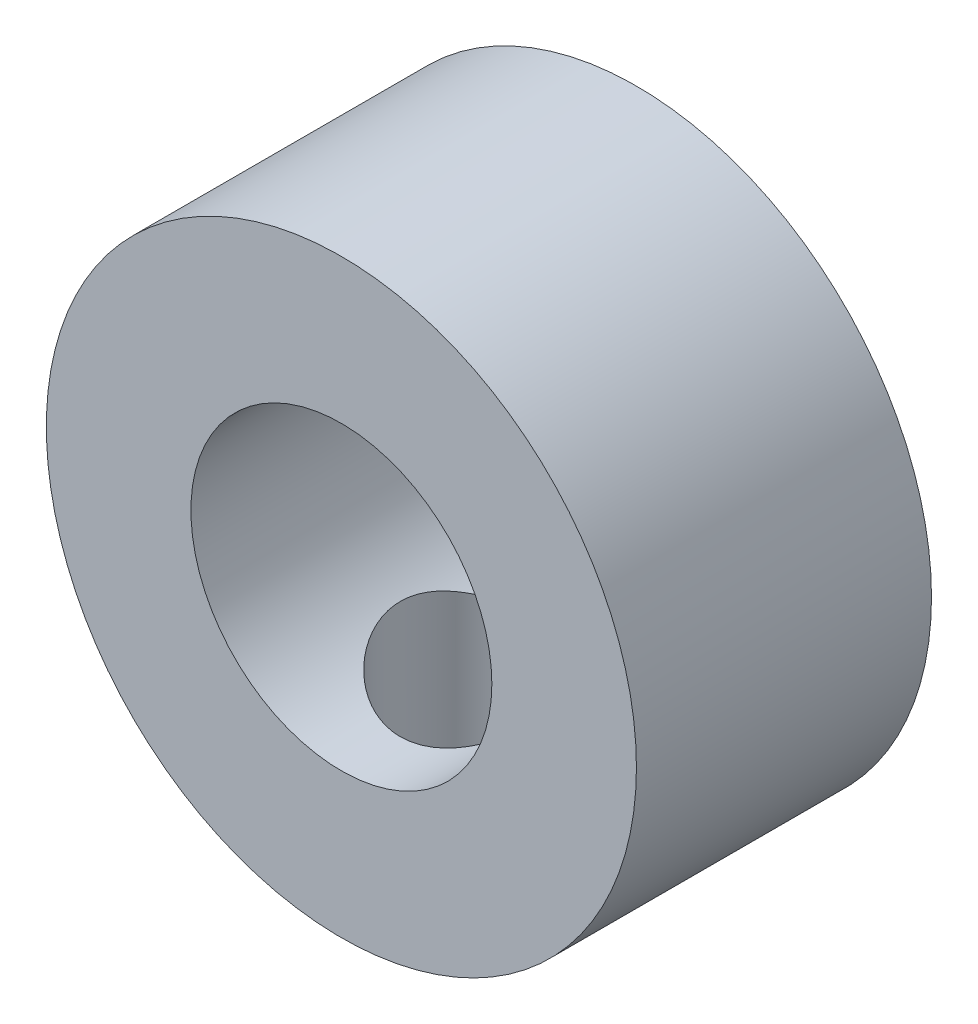
ISO-10303-21;
HEADER;
FILE_DESCRIPTION(('STEP AP214'),'2;1');
FILE_NAME('part.step','',(''),(''),'','','');
FILE_SCHEMA(('AUTOMOTIVE_DESIGN { 1 0 10303 214 1 1 1 1 }'));
ENDSEC;
DATA;
#1=APPLICATION_CONTEXT('core data for automotive mechanical design processes');
#2=APPLICATION_PROTOCOL_DEFINITION('international standard','automotive_design',2000,#1);
#3=PRODUCT_CONTEXT('',#1,'mechanical');
#4=PRODUCT('Part','Part','',(#3));
#5=PRODUCT_RELATED_PRODUCT_CATEGORY('part','',(#4));
#6=PRODUCT_DEFINITION_FORMATION('','',#4);
#7=PRODUCT_DEFINITION_CONTEXT('part definition',#1,'design');
#8=PRODUCT_DEFINITION('design','',#6,#7);
#9=PRODUCT_DEFINITION_SHAPE('','',#8);
#10=(LENGTH_UNIT() NAMED_UNIT(*) SI_UNIT(.MILLI.,.METRE.));
#11=(NAMED_UNIT(*) PLANE_ANGLE_UNIT() SI_UNIT($,.RADIAN.));
#12=(NAMED_UNIT(*) SI_UNIT($,.STERADIAN.) SOLID_ANGLE_UNIT());
#13=UNCERTAINTY_MEASURE_WITH_UNIT(LENGTH_MEASURE(1.E-05),#10,'distance_accuracy_value','');
#14=(GEOMETRIC_REPRESENTATION_CONTEXT(3) GLOBAL_UNCERTAINTY_ASSIGNED_CONTEXT((#13)) GLOBAL_UNIT_ASSIGNED_CONTEXT((#10,
#11,#12)) REPRESENTATION_CONTEXT('',''));
#15=CARTESIAN_POINT('',(0.,0.,0.));
#16=DIRECTION('',(0.,0.,1.));
#17=DIRECTION('',(1.,0.,0.));
#18=AXIS2_PLACEMENT_3D('',#15,#16,#17);
#19=CARTESIAN_POINT('',(0.,0.,5.));
#20=DIRECTION('',(0.,0.,1.));
#21=DIRECTION('',(1.,0.,0.));
#22=AXIS2_PLACEMENT_3D('',#19,#20,#21);
#23=PLANE('',#22);
#24=CARTESIAN_POINT('',(0.,0.,5.));
#25=DIRECTION('',(0.,0.,1.));
#26=DIRECTION('',(1.,0.,0.));
#27=AXIS2_PLACEMENT_3D('',#24,#25,#26);
#28=CIRCLE('',#27,5.);
#29=CARTESIAN_POINT('',(5.,0.,5.));
#30=VERTEX_POINT('',#29);
#31=EDGE_CURVE('E10',#30,#30,#28,.T.);
#32=ORIENTED_EDGE('',*,*,#31,.T.);
#33=EDGE_LOOP('',(#32));
#34=FACE_BOUND('',#33,.T.);
#35=CARTESIAN_POINT('',(0.,0.,5.));
#36=DIRECTION('',(0.,0.,1.));
#37=DIRECTION('',(1.,0.,0.));
#38=AXIS2_PLACEMENT_3D('',#35,#36,#37);
#39=CIRCLE('',#38,2.55);
#40=CARTESIAN_POINT('',(2.55,0.,5.));
#41=VERTEX_POINT('',#40);
#42=EDGE_CURVE('E51',#41,#41,#39,.T.);
#43=ORIENTED_EDGE('',*,*,#42,.F.);
#44=EDGE_LOOP('',(#43));
#45=FACE_BOUND('',#44,.T.);
#46=ADVANCED_FACE('F32',(#34,#45),#23,.T.);
#47=CARTESIAN_POINT('',(0.,0.,0.));
#48=DIRECTION('',(0.,0.,1.));
#49=DIRECTION('',(1.,0.,0.));
#50=AXIS2_PLACEMENT_3D('',#47,#48,#49);
#51=PLANE('',#50);
#52=CARTESIAN_POINT('',(0.,0.,0.));
#53=DIRECTION('',(0.,0.,1.));
#54=DIRECTION('',(1.,0.,0.));
#55=AXIS2_PLACEMENT_3D('',#52,#53,#54);
#56=CIRCLE('',#55,5.);
#57=CARTESIAN_POINT('',(5.,0.,0.));
#58=VERTEX_POINT('',#57);
#59=EDGE_CURVE('E46',#58,#58,#56,.T.);
#60=ORIENTED_EDGE('',*,*,#59,.F.);
#61=EDGE_LOOP('',(#60));
#62=FACE_BOUND('',#61,.T.);
#63=CARTESIAN_POINT('',(0.,0.,0.));
#64=DIRECTION('',(0.,0.,1.));
#65=DIRECTION('',(1.,0.,0.));
#66=AXIS2_PLACEMENT_3D('',#63,#64,#65);
#67=CIRCLE('',#66,2.55);
#68=CARTESIAN_POINT('',(2.55,0.,0.));
#69=VERTEX_POINT('',#68);
#70=EDGE_CURVE('E53',#69,#69,#67,.T.);
#71=ORIENTED_EDGE('',*,*,#70,.T.);
#72=EDGE_LOOP('',(#71));
#73=FACE_BOUND('',#72,.T.);
#74=ADVANCED_FACE('F74',(#62,#73),#51,.F.);
#75=CARTESIAN_POINT('',(0.,0.,5.));
#76=DIRECTION('',(0.,0.,-1.));
#77=DIRECTION('',(-1.,0.,0.));
#78=AXIS2_PLACEMENT_3D('',#75,#76,#77);
#79=CYLINDRICAL_SURFACE('',#78,5.);
#80=CARTESIAN_POINT('',(0.,-5.,4.));
#81=CARTESIAN_POINT('',(0.0822886127532999,-4.9999992925055,3.99999900251511));
#82=CARTESIAN_POINT('',(0.164587318351529,-4.99794915693954,3.99320613637603));
#83=CARTESIAN_POINT('',(0.326788125304881,-4.98997105593691,3.9662786457779));
#84=CARTESIAN_POINT('',(0.40668950441142,-4.98404193389692,3.94614004197666));
#85=CARTESIAN_POINT('',(0.561732707754526,-4.96895552501836,3.89325398308974));
#86=CARTESIAN_POINT('',(0.636881364395373,-4.95980300250425,3.86052513038106));
#87=CARTESIAN_POINT('',(0.780624181053131,-4.93922109237645,3.78346390694416));
#88=CARTESIAN_POINT('',(0.849217467469669,-4.92779140192067,3.73912999260458));
#89=CARTESIAN_POINT('',(0.979871797183745,-4.90350737192774,3.63877599252733));
#90=CARTESIAN_POINT('',(1.04171807124434,-4.89062383657036,3.58248337411409));
#91=CARTESIAN_POINT('',(1.15524920923324,-4.86505834210442,3.46039077008982));
#92=CARTESIAN_POINT('',(1.20693236327441,-4.85237641724501,3.39458918787504));
#93=CARTESIAN_POINT('',(1.29980037723708,-4.82834113993772,3.25352924696239));
#94=CARTESIAN_POINT('',(1.34072309022213,-4.81702406663875,3.17809153900926));
#95=CARTESIAN_POINT('',(1.4092139477476,-4.79743620394031,3.02101074576971));
#96=CARTESIAN_POINT('',(1.43678529919973,-4.78916468313311,2.93936915607202));
#97=CARTESIAN_POINT('',(1.47701633682652,-4.77690870838434,2.77460973386954));
#98=CARTESIAN_POINT('',(1.49007196234677,-4.77281069324533,2.69159725613606));
#99=CARTESIAN_POINT('',(1.50213730614672,-4.76902789749767,2.52446684378323));
#100=CARTESIAN_POINT('',(1.50115042761078,-4.76934204760571,2.44034918194091));
#101=CARTESIAN_POINT('',(1.48546977199812,-4.77424744067778,2.27661609139152));
#102=CARTESIAN_POINT('',(1.47127205262685,-4.7786838859914,2.19694774963776));
#103=CARTESIAN_POINT('',(1.43037420427056,-4.79108356228624,2.04118021372654));
#104=CARTESIAN_POINT('',(1.40367284141641,-4.79904714132351,1.96508137262567));
#105=CARTESIAN_POINT('',(1.33816026653682,-4.81772733074973,1.81739965033926));
#106=CARTESIAN_POINT('',(1.29918816934642,-4.82848016115952,1.74589291604474));
#107=CARTESIAN_POINT('',(1.21035222588683,-4.85150987000065,1.61026797798981));
#108=CARTESIAN_POINT('',(1.16048574002588,-4.86378711746991,1.54615157058622));
#109=CARTESIAN_POINT('',(1.04881290765546,-4.88911011297937,1.42431380923798));
#110=CARTESIAN_POINT('',(0.986594907466972,-4.90216654310498,1.36697133597033));
#111=CARTESIAN_POINT('',(0.853263259313967,-4.92712244063259,1.26344601593575));
#112=CARTESIAN_POINT('',(0.782149051860888,-4.9390218351841,1.21726387158557));
#113=CARTESIAN_POINT('',(0.632355038342803,-4.9604316006947,1.13714007753527));
#114=CARTESIAN_POINT('',(0.55362774974795,-4.96992543668314,1.10328248375014));
#115=CARTESIAN_POINT('',(0.391245415603519,-4.98533521832222,1.04940040990037));
#116=CARTESIAN_POINT('',(0.307591751589582,-4.99125216186999,1.02937207146751));
#117=CARTESIAN_POINT('',(0.140952242668332,-4.99868364643538,1.00434782210061));
#118=CARTESIAN_POINT('',(0.0580500976011872,-5.0003485041779,0.99883841419839));
#119=CARTESIAN_POINT('',(-0.107499605823383,-4.9995292324176,1.00156915571208));
#120=CARTESIAN_POINT('',(-0.19014719669078,-4.99704565677756,1.00980746965144));
#121=CARTESIAN_POINT('',(-0.350903605309696,-4.98830696987163,1.0393846111115));
#122=CARTESIAN_POINT('',(-0.429072772614169,-4.98213829799417,1.06042338758087));
#123=CARTESIAN_POINT('',(-0.580754638954521,-4.96674347841533,1.1146432327782));
#124=CARTESIAN_POINT('',(-0.654266777025583,-4.95751696321085,1.14782576103786));
#125=CARTESIAN_POINT('',(-0.796437189461052,-4.93669654351325,1.22625316548113));
#126=CARTESIAN_POINT('',(-0.864943826199669,-4.92505280829675,1.27175934094797));
#127=CARTESIAN_POINT('',(-0.993523307980146,-4.90073468764318,1.37322475405281));
#128=CARTESIAN_POINT('',(-1.05359403235593,-4.8880600443108,1.42918661188767));
#129=CARTESIAN_POINT('',(-1.16585744551027,-4.86253171869138,1.55238730836935));
#130=CARTESIAN_POINT('',(-1.21768481231503,-4.84968825033268,1.61996187577174));
#131=CARTESIAN_POINT('',(-1.30928995072153,-4.82576515238463,1.76312793901353));
#132=CARTESIAN_POINT('',(-1.34906803829472,-4.81468547654651,1.83871922455821));
#133=CARTESIAN_POINT('',(-1.41517347127168,-4.79567189615055,1.99553249125469));
#134=CARTESIAN_POINT('',(-1.4415634693705,-4.78772337843827,2.07672618653659));
#135=CARTESIAN_POINT('',(-1.48021730815114,-4.77591594362794,2.24268796893148));
#136=CARTESIAN_POINT('',(-1.49248598978779,-4.772055625083,2.32745482078767));
#137=CARTESIAN_POINT('',(-1.50221984485059,-4.76899972496087,2.49436151837623));
#138=CARTESIAN_POINT('',(-1.5002805530849,-4.76961647442755,2.57646365101759));
#139=CARTESIAN_POINT('',(-1.48307505444813,-4.77499401288294,2.7391141033728));
#140=CARTESIAN_POINT('',(-1.46780938124716,-4.77975463592551,2.81966248517635));
#141=CARTESIAN_POINT('',(-1.42476888804136,-4.79275763670385,2.97594539914285));
#142=CARTESIAN_POINT('',(-1.39715175507068,-4.80095604545965,3.05172728736169));
#143=CARTESIAN_POINT('',(-1.33031507121129,-4.81990278909136,3.19764243881772));
#144=CARTESIAN_POINT('',(-1.29109329962876,-4.83065161194312,3.26777461764076));
#145=CARTESIAN_POINT('',(-1.20048763805072,-4.85397676425833,3.40316311652711));
#146=CARTESIAN_POINT('',(-1.14871276092994,-4.86660540163798,3.46814876126041));
#147=CARTESIAN_POINT('',(-1.03517434629782,-4.89201320450026,3.58870249830786));
#148=CARTESIAN_POINT('',(-0.973408217134501,-4.90479240823905,3.64426813946776));
#149=CARTESIAN_POINT('',(-0.839465762183248,-4.92950936570649,3.74602341229503));
#150=CARTESIAN_POINT('',(-0.767037885790607,-4.94141159765674,3.79189144685549));
#151=CARTESIAN_POINT('',(-0.615141373983529,-4.96260680455813,3.87073516990403));
#152=CARTESIAN_POINT('',(-0.535676052998955,-4.97190099931067,3.90371688827451));
#153=CARTESIAN_POINT('',(-0.380757712655281,-4.98602174969301,3.95289527565275));
#154=CARTESIAN_POINT('',(-0.305786961954234,-4.99122027381068,3.97051167288325));
#155=CARTESIAN_POINT('',(-0.153880195230779,-4.99820944494492,3.99406352524158));
#156=CARTESIAN_POINT('',(-0.0769445098581395,-5.0000006615474,4.00000093270482));
#157=CARTESIAN_POINT('',(0.,-5.,4.));
#158=B_SPLINE_CURVE_WITH_KNOTS('',3,(#80,#81,#82,#83,#84,#85,#86,#87,#88,#89,#90,#91,#92,#93,
#94,#95,#96,#97,#98,#99,#100,#101,#102,#103,#104,#105,#106,#107,#108,#109,#110,#111,#112,#113,
#114,#115,#116,#117,#118,#119,#120,#121,#122,#123,#124,#125,#126,#127,#128,#129,#130,#131,#132,
#133,#134,#135,#136,#137,#138,#139,#140,#141,#142,#143,#144,#145,#146,#147,#148,#149,#150,#151,
#152,#153,#154,#155,#156,#157),.UNSPECIFIED.,.T.,.F.,(4,2,2,2,2,2,2,2,2,2,2,2,2,2,2,2,2,2,2,2,2,
2,2,2,2,2,2,2,2,2,2,2,2,2,2,2,2,2,4),(0.,0.246583203612611,0.493239964845999,0.739533676300874,
0.985860164412702,1.23855602948191,1.49129437288633,1.74971481004109,2.00807314543224,
2.25919689356599,2.51025978319089,2.75226016697676,2.99428443658001,3.23962426447119,
3.48502360158555,3.74067104048167,3.99633456531071,4.25371046881689,4.51101453528808,
4.75908809438545,5.00712853550327,5.24956746682327,5.49203554593728,5.74011305702908,
5.98825282000191,6.24540400322818,6.5025484425268,6.75847814951252,7.01432009460283,
7.25950155466942,7.504673196616,7.74680040402721,7.98897397553107,8.2399692567993,
8.49102974897502,8.7494299615667,9.00770911595235,9.23831691930459,9.46888616948874),.UNSPECIFIED.);
#159=CARTESIAN_POINT('',(0.,-5.,4.));
#160=VERTEX_POINT('',#159);
#161=EDGE_CURVE('E56',#160,#160,#158,.T.);
#162=ORIENTED_EDGE('',*,*,#161,.T.);
#163=EDGE_LOOP('',(#162));
#164=FACE_BOUND('',#163,.T.);
#165=ORIENTED_EDGE('',*,*,#31,.F.);
#166=EDGE_LOOP('',(#165));
#167=FACE_BOUND('',#166,.T.);
#168=ORIENTED_EDGE('',*,*,#59,.T.);
#169=EDGE_LOOP('',(#168));
#170=FACE_BOUND('',#169,.T.);
#171=ADVANCED_FACE('F34',(#164,#167,#170),#79,.T.);
#172=CARTESIAN_POINT('',(0.,0.,5.));
#173=DIRECTION('',(0.,0.,-1.));
#174=DIRECTION('',(-1.,0.,0.));
#175=AXIS2_PLACEMENT_3D('',#172,#173,#174);
#176=CYLINDRICAL_SURFACE('',#175,2.55);
#177=CARTESIAN_POINT('',(0.,-2.55,4.));
#178=CARTESIAN_POINT('',(0.0769834030141568,-2.54999387035735,3.99999305647011));
#179=CARTESIAN_POINT('',(0.154080738715479,-2.54647563661658,3.99403263951308));
#180=CARTESIAN_POINT('',(0.305988071752013,-2.53273068444616,3.9704802761875));
#181=CARTESIAN_POINT('',(0.380791309668883,-2.52248582541092,3.95285687564281));
#182=CARTESIAN_POINT('',(0.52556033017075,-2.4963314487874,3.90695550441227));
#183=CARTESIAN_POINT('',(0.595548040963552,-2.48044996308686,3.87873021887599));
#184=CARTESIAN_POINT('',(0.729584144287755,-2.44438756592114,3.81274236831428));
#185=CARTESIAN_POINT('',(0.793634394817821,-2.42420800600732,3.77498280070171));
#186=CARTESIAN_POINT('',(0.919402380549693,-2.37949140166581,3.68784801935919));
#187=CARTESIAN_POINT('',(0.98058742935454,-2.35474133963835,3.63781529645388));
#188=CARTESIAN_POINT('',(1.09421823149642,-2.30414066088766,3.52902145094267));
#189=CARTESIAN_POINT('',(1.14665287241768,-2.27828869631908,3.47024940634232));
#190=CARTESIAN_POINT('',(1.24749478317438,-2.2248319436702,3.33755096194133));
#191=CARTESIAN_POINT('',(1.29471676144252,-2.19737499092928,3.26265635360476));
#192=CARTESIAN_POINT('',(1.37571426185691,-2.14759890003646,3.10438360086915));
#193=CARTESIAN_POINT('',(1.40951108427838,-2.12527164705871,3.02101916073593));
#194=CARTESIAN_POINT('',(1.45580562683429,-2.09373450246308,2.86802760580293));
#195=CARTESIAN_POINT('',(1.47143194210528,-2.08268004780358,2.79972863725244));
#196=CARTESIAN_POINT('',(1.49299295521335,-2.06728200150309,2.66090685511082));
#197=CARTESIAN_POINT('',(1.49893898779593,-2.06293056155309,2.59038674109623));
#198=CARTESIAN_POINT('',(1.50080215754229,-2.06157584084914,2.44902235799851));
#199=CARTESIAN_POINT('',(1.49670226641141,-2.06458503669051,2.3781777419751));
#200=CARTESIAN_POINT('',(1.47869205783705,-2.07751933261925,2.23837913942275));
#201=CARTESIAN_POINT('',(1.46477461507524,-2.08744945566909,2.16942656387029));
#202=CARTESIAN_POINT('',(1.42801413511205,-2.11276166033829,2.03573161303157));
#203=CARTESIAN_POINT('',(1.40525174560248,-2.12809436699916,1.97095719375109));
#204=CARTESIAN_POINT('',(1.35161631328246,-2.16255575970916,1.84596271162587));
#205=CARTESIAN_POINT('',(1.32074024232772,-2.18168586234846,1.78574436000153));
#206=CARTESIAN_POINT('',(1.24573661936821,-2.22549474173058,1.660767484047));
#207=CARTESIAN_POINT('',(1.20025168396159,-2.2505649557596,1.59696007803331));
#208=CARTESIAN_POINT('',(1.10003158527549,-2.30121457499646,1.47724219303754));
#209=CARTESIAN_POINT('',(1.04528795389733,-2.32679442725825,1.42133903007647));
#210=CARTESIAN_POINT('',(0.919720494179618,-2.37945754425591,1.31175966088491));
#211=CARTESIAN_POINT('',(0.847734507046058,-2.40631213423717,1.25929101121998));
#212=CARTESIAN_POINT('',(0.694325156730878,-2.45496876805585,1.16737418534773));
#213=CARTESIAN_POINT('',(0.612907321660725,-2.47677374927234,1.1279184337867));
#214=CARTESIAN_POINT('',(0.448394302778248,-2.51157991748809,1.06607453199957));
#215=CARTESIAN_POINT('',(0.365765023144962,-2.52506743129572,1.04273127118912));
#216=CARTESIAN_POINT('',(0.196855892123348,-2.54380401779276,1.0104979960945));
#217=CARTESIAN_POINT('',(0.110580191326313,-2.54906221135954,1.00159198005491));
#218=CARTESIAN_POINT('',(-0.0510240412017211,-2.55060183239036,0.998978867631138));
#219=CARTESIAN_POINT('',(-0.126320077288284,-2.54795976191143,1.00344915602648));
#220=CARTESIAN_POINT('',(-0.274893342145767,-2.53623415575386,1.02350059343705));
#221=CARTESIAN_POINT('',(-0.348170577099096,-2.5271506398039,1.03908170842237));
#222=CARTESIAN_POINT('',(-0.489432912575392,-2.50359699830453,1.08022011646155));
#223=CARTESIAN_POINT('',(-0.557489977087734,-2.48922774267965,1.10559100506705));
#224=CARTESIAN_POINT('',(-0.688392431065788,-2.45625272213017,1.16534742964627));
#225=CARTESIAN_POINT('',(-0.751236700571291,-2.43764605000352,1.19973489624697));
#226=CARTESIAN_POINT('',(-0.877001740602611,-2.39545674361377,1.28056377447077));
#227=CARTESIAN_POINT('',(-0.939247573108745,-2.37155759069325,1.32788805390476));
#228=CARTESIAN_POINT('',(-1.0553938278062,-2.32220483457066,1.4312626202959));
#229=CARTESIAN_POINT('',(-1.1092843732951,-2.29674944054839,1.48732307966281));
#230=CARTESIAN_POINT('',(-1.21397151779752,-2.24335265489331,1.6146322553688));
#231=CARTESIAN_POINT('',(-1.26357641029115,-2.21548964060279,1.68690062926304));
#232=CARTESIAN_POINT('',(-1.34990824467973,-2.16397356287028,1.84010989116431));
#233=CARTESIAN_POINT('',(-1.38665045619508,-2.14031552413852,1.92104034607036));
#234=CARTESIAN_POINT('',(-1.43923724484973,-2.10520147710431,2.07162065747276));
#235=CARTESIAN_POINT('',(-1.45788116804141,-2.09221373738061,2.13993263707449));
#236=CARTESIAN_POINT('',(-1.48538105390894,-2.07278415850345,2.27937163703656));
#237=CARTESIAN_POINT('',(-1.49424961350519,-2.06633389576378,2.35049491186283));
#238=CARTESIAN_POINT('',(-1.50170641739174,-2.06092275748992,2.49378901348532));
#239=CARTESIAN_POINT('',(-1.50026401354796,-2.06198420955656,2.56596232639924));
#240=CARTESIAN_POINT('',(-1.48711896342983,-2.07148200448262,2.70888846113023));
#241=CARTESIAN_POINT('',(-1.47541021259241,-2.07992273519122,2.77964041217023));
#242=CARTESIAN_POINT('',(-1.44297451598014,-2.10254444190978,2.91536757448846));
#243=CARTESIAN_POINT('',(-1.42257432646869,-2.11651624399681,2.98045802275673));
#244=CARTESIAN_POINT('',(-1.37362978936694,-2.14860304470618,3.10639180437891));
#245=CARTESIAN_POINT('',(-1.34508237845748,-2.16671960122865,3.16723352950149));
#246=CARTESIAN_POINT('',(-1.27556399815447,-2.2084655588545,3.29301283334544));
#247=CARTESIAN_POINT('',(-1.23335371373446,-2.23251421426608,3.35712554734133));
#248=CARTESIAN_POINT('',(-1.13990637146667,-2.28164535065153,3.47798659627646));
#249=CARTESIAN_POINT('',(-1.0886620979585,-2.3067286456561,3.53472898096401));
#250=CARTESIAN_POINT('',(-0.96970078228751,-2.35944954757615,3.64776186522093));
#251=CARTESIAN_POINT('',(-0.900669724332885,-2.38692110363536,3.7027615343748));
#252=CARTESIAN_POINT('',(-0.752877740499426,-2.43757688031252,3.80039263232039));
#253=CARTESIAN_POINT('',(-0.674114232915798,-2.46075995924592,3.84302076925835));
#254=CARTESIAN_POINT('',(-0.51219012359719,-2.49935075748825,3.91246457697444));
#255=CARTESIAN_POINT('',(-0.429362816800279,-2.51504921896699,3.93987982498875));
#256=CARTESIAN_POINT('',(-0.301925970507378,-2.53242813061777,3.96994976205703));
#257=CARTESIAN_POINT('',(-0.258964221833944,-2.53719107765704,3.97812792421287));
#258=CARTESIAN_POINT('',(-0.172316904488787,-2.54454057656616,3.99070966003075));
#259=CARTESIAN_POINT('',(-0.128631928880242,-2.54712882955859,3.99511618405202));
#260=CARTESIAN_POINT('',(-0.0565871628299431,-2.54952984390426,3.99920048980433));
#261=CARTESIAN_POINT('',(-0.0283012804501669,-2.55000225343034,4.00000255263835));
#262=CARTESIAN_POINT('',(0.,-2.55,4.));
#263=B_SPLINE_CURVE_WITH_KNOTS('',3,(#177,#178,#179,#180,#181,#182,#183,#184,#185,#186,#187,
#188,#189,#190,#191,#192,#193,#194,#195,#196,#197,#198,#199,#200,#201,#202,#203,#204,#205,#206,
#207,#208,#209,#210,#211,#212,#213,#214,#215,#216,#217,#218,#219,#220,#221,#222,#223,#224,#225,
#226,#227,#228,#229,#230,#231,#232,#233,#234,#235,#236,#237,#238,#239,#240,#241,#242,#243,#244,
#245,#246,#247,#248,#249,#250,#251,#252,#253,#254,#255,#256,#257,#258,#259,#260,#261,#262),
.UNSPECIFIED.,.T.,.F.,(4,2,2,2,2,2,2,2,2,2,2,2,2,2,2,2,2,2,2,2,2,2,2,2,2,2,2,2,2,2,2,2,2,2,2,2,
2,2,2,2,2,2,4),(0.,0.230847911194792,0.462320952638293,0.692658608526362,0.922923940217465,
1.17041022990823,1.41820845712606,1.69494294984758,1.97123660653237,2.18311896538283,
2.39475305003309,2.6067461121022,2.8188931916183,3.0291496760546,3.23948474300203,
3.48534662632937,3.73143460569539,4.00911975436257,4.28664296435034,4.54583751546863,
4.80474458717324,5.0300486477856,5.25535201834648,5.47656177188381,5.69781892952157,
5.94214074966275,6.18674921368707,6.46138224922345,6.73568814634574,6.95076024915889,
7.16555487635177,7.38098822038326,7.5965497520734,7.80463729569847,8.01280318263025,
8.25320656340152,8.4938028372528,8.76974228162622,9.04575508160466,9.30993429620334,
9.44172931322151,9.57342113928209,9.65828737304494),.UNSPECIFIED.);
#264=CARTESIAN_POINT('',(0.,-2.55,4.));
#265=VERTEX_POINT('',#264);
#266=EDGE_CURVE('E37',#265,#265,#263,.T.);
#267=ORIENTED_EDGE('',*,*,#266,.F.);
#268=EDGE_LOOP('',(#267));
#269=FACE_BOUND('',#268,.T.);
#270=ORIENTED_EDGE('',*,*,#42,.T.);
#271=EDGE_LOOP('',(#270));
#272=FACE_BOUND('',#271,.T.);
#273=ORIENTED_EDGE('',*,*,#70,.F.);
#274=EDGE_LOOP('',(#273));
#275=FACE_BOUND('',#274,.T.);
#276=ADVANCED_FACE('F66',(#269,#272,#275),#176,.F.);
#277=CARTESIAN_POINT('',(0.,-5.,2.5));
#278=DIRECTION('',(0.,1.,0.));
#279=DIRECTION('',(0.,0.,1.));
#280=AXIS2_PLACEMENT_3D('',#277,#278,#279);
#281=CYLINDRICAL_SURFACE('',#280,1.5);
#282=ORIENTED_EDGE('',*,*,#266,.T.);
#283=EDGE_LOOP('',(#282));
#284=FACE_BOUND('',#283,.T.);
#285=ORIENTED_EDGE('',*,*,#161,.F.);
#286=EDGE_LOOP('',(#285));
#287=FACE_BOUND('',#286,.T.);
#288=ADVANCED_FACE('F63',(#284,#287),#281,.F.);
#289=CLOSED_SHELL('',(#46,#74,#171,#276,#288));
#290=MANIFOLD_SOLID_BREP('B2',#289);
#291=ADVANCED_BREP_SHAPE_REPRESENTATION('',(#18,#290),#14);
#292=SHAPE_DEFINITION_REPRESENTATION(#9,#291);
ENDSEC;
END-ISO-10303-21;
